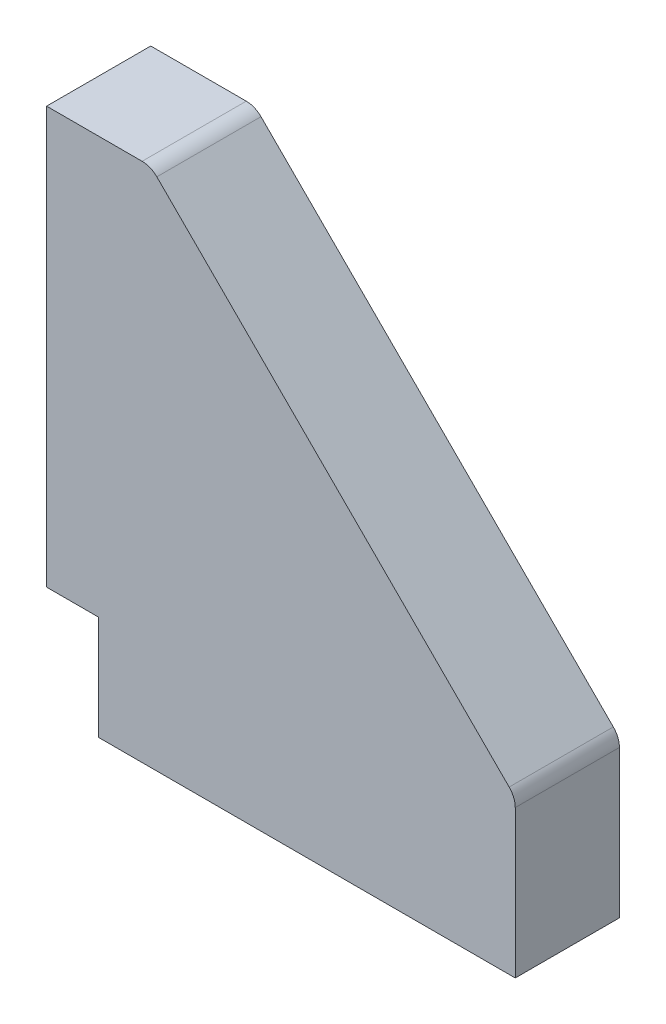
ISO-10303-21;
HEADER;
FILE_DESCRIPTION(('STEP AP214'),'2;1');
FILE_NAME('part.step','',(''),(''),'','','');
FILE_SCHEMA(('AUTOMOTIVE_DESIGN { 1 0 10303 214 1 1 1 1 }'));
ENDSEC;
DATA;
#1=APPLICATION_CONTEXT('core data for automotive mechanical design processes');
#2=APPLICATION_PROTOCOL_DEFINITION('international standard','automotive_design',2000,#1);
#3=PRODUCT_CONTEXT('',#1,'mechanical');
#4=PRODUCT('Part','Part','',(#3));
#5=PRODUCT_RELATED_PRODUCT_CATEGORY('part','',(#4));
#6=PRODUCT_DEFINITION_FORMATION('','',#4);
#7=PRODUCT_DEFINITION_CONTEXT('part definition',#1,'design');
#8=PRODUCT_DEFINITION('design','',#6,#7);
#9=PRODUCT_DEFINITION_SHAPE('','',#8);
#10=(LENGTH_UNIT() NAMED_UNIT(*) SI_UNIT(.MILLI.,.METRE.));
#11=(NAMED_UNIT(*) PLANE_ANGLE_UNIT() SI_UNIT($,.RADIAN.));
#12=(NAMED_UNIT(*) SI_UNIT($,.STERADIAN.) SOLID_ANGLE_UNIT());
#13=UNCERTAINTY_MEASURE_WITH_UNIT(LENGTH_MEASURE(1.E-05),#10,'distance_accuracy_value','');
#14=(GEOMETRIC_REPRESENTATION_CONTEXT(3) GLOBAL_UNCERTAINTY_ASSIGNED_CONTEXT((#13)) GLOBAL_UNIT_ASSIGNED_CONTEXT((#10,
#11,#12)) REPRESENTATION_CONTEXT('',''));
#15=CARTESIAN_POINT('',(0.,0.,0.));
#16=DIRECTION('',(0.,0.,1.));
#17=DIRECTION('',(1.,0.,0.));
#18=AXIS2_PLACEMENT_3D('',#15,#16,#17);
#19=CARTESIAN_POINT('',(0.,0.,12.7));
#20=DIRECTION('',(1.,0.,0.));
#21=DIRECTION('',(0.,0.,-1.));
#22=AXIS2_PLACEMENT_3D('',#19,#20,#21);
#23=PLANE('',#22);
#24=DIRECTION('',(0.,0.,1.));
#25=VECTOR('',#24,1.);
#26=CARTESIAN_POINT('',(0.,0.,0.));
#27=LINE('',#26,#25);
#28=CARTESIAN_POINT('',(0.,0.,0.));
#29=VERTEX_POINT('',#28);
#30=CARTESIAN_POINT('',(0.,0.,12.7));
#31=VERTEX_POINT('',#30);
#32=EDGE_CURVE('E63',#29,#31,#27,.T.);
#33=ORIENTED_EDGE('',*,*,#32,.F.);
#34=DIRECTION('',(0.,-1.,0.));
#35=VECTOR('',#34,1.);
#36=CARTESIAN_POINT('',(0.,0.,0.));
#37=LINE('',#36,#35);
#38=CARTESIAN_POINT('',(0.,-12.7,0.));
#39=VERTEX_POINT('',#38);
#40=EDGE_CURVE('E169',#29,#39,#37,.T.);
#41=ORIENTED_EDGE('',*,*,#40,.T.);
#42=DIRECTION('',(0.,0.,-1.));
#43=VECTOR('',#42,1.);
#44=CARTESIAN_POINT('',(0.,-12.7,0.));
#45=LINE('',#44,#43);
#46=CARTESIAN_POINT('',(0.,-12.7,12.7));
#47=VERTEX_POINT('',#46);
#48=EDGE_CURVE('E173',#47,#39,#45,.T.);
#49=ORIENTED_EDGE('',*,*,#48,.F.);
#50=DIRECTION('',(0.,-1.,0.));
#51=VECTOR('',#50,1.);
#52=CARTESIAN_POINT('',(0.,0.,12.7));
#53=LINE('',#52,#51);
#54=EDGE_CURVE('E230',#31,#47,#53,.T.);
#55=ORIENTED_EDGE('',*,*,#54,.F.);
#56=EDGE_LOOP('',(#33,#41,#49,#55));
#57=FACE_BOUND('',#56,.T.);
#58=ADVANCED_FACE('F48',(#57),#23,.F.);
#59=CARTESIAN_POINT('',(7.62,6.35,6.38525672213319));
#60=DIRECTION('',(-1.,0.,0.));
#61=DIRECTION('',(0.,0.,1.));
#62=AXIS2_PLACEMENT_3D('',#59,#60,#61);
#63=CYLINDRICAL_SURFACE('',#62,3.175);
#64=DIRECTION('',(-1.,0.,0.));
#65=VECTOR('',#64,1.);
#66=CARTESIAN_POINT('',(7.62,7.62,9.29519228843015));
#67=LINE('',#66,#65);
#68=CARTESIAN_POINT('',(5.08,7.62,9.29519228843015));
#69=VERTEX_POINT('',#68);
#70=CARTESIAN_POINT('',(7.62,7.62,9.29519228843015));
#71=VERTEX_POINT('',#70);
#72=EDGE_CURVE('E202',#69,#71,#67,.F.);
#73=ORIENTED_EDGE('',*,*,#72,.F.);
#74=CARTESIAN_POINT('',(6.35,6.35,6.38525672213319));
#75=DIRECTION('',(-0.707106781186548,-0.707106781186547,0.));
#76=DIRECTION('',(-0.707106781186547,0.707106781186548,0.));
#77=AXIS2_PLACEMENT_3D('',#74,#75,#76);
#78=ELLIPSE('',#77,4.49012806053458,3.175);
#79=CARTESIAN_POINT('',(6.35,6.35,9.56025672213319));
#80=VERTEX_POINT('',#79);
#81=EDGE_CURVE('E212',#80,#69,#78,.T.);
#82=ORIENTED_EDGE('',*,*,#81,.F.);
#83=CARTESIAN_POINT('',(6.35,6.35,6.38525672213319));
#84=DIRECTION('',(-0.707106781186547,0.707106781186548,0.));
#85=DIRECTION('',(-0.707106781186548,-0.707106781186547,0.));
#86=AXIS2_PLACEMENT_3D('',#83,#84,#85);
#87=ELLIPSE('',#86,4.49012806053458,3.175);
#88=CARTESIAN_POINT('',(6.35,6.35,3.21025672213319));
#89=VERTEX_POINT('',#88);
#90=EDGE_CURVE('E206',#89,#80,#87,.T.);
#91=ORIENTED_EDGE('',*,*,#90,.F.);
#92=CARTESIAN_POINT('',(5.08000000000001,7.62,3.47532115583623));
#93=VERTEX_POINT('',#92);
#94=EDGE_CURVE('E209',#93,#89,#78,.T.);
#95=ORIENTED_EDGE('',*,*,#94,.F.);
#96=DIRECTION('',(-1.,0.,0.));
#97=VECTOR('',#96,1.);
#98=CARTESIAN_POINT('',(7.62,7.62,3.47532115583623));
#99=LINE('',#98,#97);
#100=CARTESIAN_POINT('',(7.62,7.62,3.47532115583623));
#101=VERTEX_POINT('',#100);
#102=EDGE_CURVE('E196',#101,#93,#99,.T.);
#103=ORIENTED_EDGE('',*,*,#102,.F.);
#104=CARTESIAN_POINT('',(7.62,6.35,6.38525672213319));
#105=DIRECTION('',(-1.,0.,0.));
#106=DIRECTION('',(0.,0.,1.));
#107=AXIS2_PLACEMENT_3D('',#104,#105,#106);
#108=CIRCLE('',#107,3.175);
#109=EDGE_CURVE('E218',#71,#101,#108,.T.);
#110=ORIENTED_EDGE('',*,*,#109,.F.);
#111=EDGE_LOOP('',(#73,#82,#91,#95,#103,#110));
#112=FACE_BOUND('',#111,.T.);
#113=CARTESIAN_POINT('',(-6.35,6.35,6.38525672213319));
#114=DIRECTION('',(-1.,0.,0.));
#115=DIRECTION('',(0.,0.,1.));
#116=AXIS2_PLACEMENT_3D('',#113,#114,#115);
#117=CIRCLE('',#116,3.175);
#118=CARTESIAN_POINT('',(-6.35,6.35,9.56025672213319));
#119=VERTEX_POINT('',#118);
#120=EDGE_CURVE('E357',#119,#119,#117,.T.);
#121=ORIENTED_EDGE('',*,*,#120,.T.);
#122=EDGE_LOOP('',(#121));
#123=FACE_BOUND('',#122,.T.);
#124=ADVANCED_FACE('F288',(#112,#123),#63,.F.);
#125=CARTESIAN_POINT('',(7.62,6.35,6.38525672213319));
#126=DIRECTION('',(-1.,0.,0.));
#127=DIRECTION('',(0.,0.,1.));
#128=AXIS2_PLACEMENT_3D('',#125,#126,#127);
#129=PLANE('',#128);
#130=ORIENTED_EDGE('',*,*,#109,.T.);
#131=DIRECTION('',(0.,0.,1.));
#132=VECTOR('',#131,1.);
#133=CARTESIAN_POINT('',(7.62,7.62,6.38525672213319));
#134=LINE('',#133,#132);
#135=EDGE_CURVE('E258',#101,#71,#134,.T.);
#136=ORIENTED_EDGE('',*,*,#135,.T.);
#137=EDGE_LOOP('',(#130,#136));
#138=FACE_BOUND('',#137,.T.);
#139=ADVANCED_FACE('F293',(#138),#129,.T.);
#140=CARTESIAN_POINT('',(50.8,6.35,12.7));
#141=DIRECTION('',(-1.,0.,0.));
#142=DIRECTION('',(0.,0.,1.));
#143=AXIS2_PLACEMENT_3D('',#140,#141,#142);
#144=PLANE('',#143);
#145=DIRECTION('',(0.,1.,0.));
#146=VECTOR('',#145,1.);
#147=CARTESIAN_POINT('',(50.8,6.35,0.));
#148=LINE('',#147,#146);
#149=CARTESIAN_POINT('',(50.8,-12.7,0.));
#150=VERTEX_POINT('',#149);
#151=CARTESIAN_POINT('',(50.8,5.29789755157234,0.));
#152=VERTEX_POINT('',#151);
#153=EDGE_CURVE('E217',#150,#152,#148,.T.);
#154=ORIENTED_EDGE('',*,*,#153,.T.);
#155=DIRECTION('',(0.,0.,-1.));
#156=VECTOR('',#155,1.);
#157=CARTESIAN_POINT('',(50.8,5.29789755157234,12.7));
#158=LINE('',#157,#156);
#159=CARTESIAN_POINT('',(50.8,5.29789755157234,12.7));
#160=VERTEX_POINT('',#159);
#161=EDGE_CURVE('E249',#152,#160,#158,.F.);
#162=ORIENTED_EDGE('',*,*,#161,.T.);
#163=DIRECTION('',(0.,1.,0.));
#164=VECTOR('',#163,1.);
#165=CARTESIAN_POINT('',(50.8,6.35,12.7));
#166=LINE('',#165,#164);
#167=CARTESIAN_POINT('',(50.8,-12.7,12.7));
#168=VERTEX_POINT('',#167);
#169=EDGE_CURVE('E222',#168,#160,#166,.T.);
#170=ORIENTED_EDGE('',*,*,#169,.F.);
#171=DIRECTION('',(0.,0.,1.));
#172=VECTOR('',#171,1.);
#173=CARTESIAN_POINT('',(50.8,-12.7,0.));
#174=LINE('',#173,#172);
#175=EDGE_CURVE('E183',#150,#168,#174,.T.);
#176=ORIENTED_EDGE('',*,*,#175,.F.);
#177=EDGE_LOOP('',(#154,#162,#170,#176));
#178=FACE_BOUND('',#177,.T.);
#179=ADVANCED_FACE('F315',(#178),#144,.F.);
#180=CARTESIAN_POINT('',(6.35,50.8,12.7));
#181=DIRECTION('',(-0.707106781186548,-0.707106781186548,0.));
#182=DIRECTION('',(0.707106781186548,-0.707106781186548,0.));
#183=AXIS2_PLACEMENT_3D('',#180,#181,#182);
#184=PLANE('',#183);
#185=DIRECTION('',(-0.707106781186547,0.707106781186547,0.));
#186=VECTOR('',#185,1.);
#187=CARTESIAN_POINT('',(6.35,50.8,12.7));
#188=LINE('',#187,#186);
#189=CARTESIAN_POINT('',(50.0560512242138,7.09394877578618,12.7));
#190=VERTEX_POINT('',#189);
#191=CARTESIAN_POINT('',(7.09394877578617,50.0560512242138,12.7));
#192=VERTEX_POINT('',#191);
#193=EDGE_CURVE('E225',#190,#192,#188,.T.);
#194=ORIENTED_EDGE('',*,*,#193,.F.);
#195=DIRECTION('',(0.,0.,-1.));
#196=VECTOR('',#195,1.);
#197=CARTESIAN_POINT('',(50.0560512242138,7.09394877578618,12.7));
#198=LINE('',#197,#196);
#199=CARTESIAN_POINT('',(50.0560512242138,7.09394877578618,0.));
#200=VERTEX_POINT('',#199);
#201=EDGE_CURVE('E242',#190,#200,#198,.T.);
#202=ORIENTED_EDGE('',*,*,#201,.T.);
#203=DIRECTION('',(-0.707106781186547,0.707106781186547,0.));
#204=VECTOR('',#203,1.);
#205=CARTESIAN_POINT('',(6.35,50.8,0.));
#206=LINE('',#205,#204);
#207=CARTESIAN_POINT('',(7.09394877578617,50.0560512242138,0.));
#208=VERTEX_POINT('',#207);
#209=EDGE_CURVE('E235',#200,#208,#206,.T.);
#210=ORIENTED_EDGE('',*,*,#209,.T.);
#211=DIRECTION('',(0.,0.,-1.));
#212=VECTOR('',#211,1.);
#213=CARTESIAN_POINT('',(7.09394877578617,50.0560512242138,12.7));
#214=LINE('',#213,#212);
#215=EDGE_CURVE('E232',#208,#192,#214,.F.);
#216=ORIENTED_EDGE('',*,*,#215,.T.);
#217=EDGE_LOOP('',(#194,#202,#210,#216));
#218=FACE_BOUND('',#217,.T.);
#219=ADVANCED_FACE('F328',(#218),#184,.F.);
#220=CARTESIAN_POINT('',(0.,50.8,12.7));
#221=DIRECTION('',(0.,-1.,0.));
#222=DIRECTION('',(0.,0.,-1.));
#223=AXIS2_PLACEMENT_3D('',#220,#221,#222);
#224=PLANE('',#223);
#225=DIRECTION('',(-1.,0.,0.));
#226=VECTOR('',#225,1.);
#227=CARTESIAN_POINT('',(0.,50.8,12.7));
#228=LINE('',#227,#226);
#229=CARTESIAN_POINT('',(5.29789755157234,50.8,12.7));
#230=VERTEX_POINT('',#229);
#231=CARTESIAN_POINT('',(-6.35,50.8,12.7));
#232=VERTEX_POINT('',#231);
#233=EDGE_CURVE('E228',#230,#232,#228,.T.);
#234=ORIENTED_EDGE('',*,*,#233,.F.);
#235=DIRECTION('',(0.,0.,-1.));
#236=VECTOR('',#235,1.);
#237=CARTESIAN_POINT('',(5.29789755157234,50.8,12.7));
#238=LINE('',#237,#236);
#239=CARTESIAN_POINT('',(5.29789755157234,50.8,0.));
#240=VERTEX_POINT('',#239);
#241=EDGE_CURVE('E255',#230,#240,#238,.T.);
#242=ORIENTED_EDGE('',*,*,#241,.T.);
#243=DIRECTION('',(-1.,0.,0.));
#244=VECTOR('',#243,1.);
#245=CARTESIAN_POINT('',(0.,50.8,0.));
#246=LINE('',#245,#244);
#247=CARTESIAN_POINT('',(-6.35,50.8,0.));
#248=VERTEX_POINT('',#247);
#249=EDGE_CURVE('E238',#240,#248,#246,.T.);
#250=ORIENTED_EDGE('',*,*,#249,.T.);
#251=DIRECTION('',(0.,0.,-1.));
#252=VECTOR('',#251,1.);
#253=CARTESIAN_POINT('',(-6.35,50.8,0.));
#254=LINE('',#253,#252);
#255=EDGE_CURVE('E162',#232,#248,#254,.T.);
#256=ORIENTED_EDGE('',*,*,#255,.F.);
#257=EDGE_LOOP('',(#234,#242,#250,#256));
#258=FACE_BOUND('',#257,.T.);
#259=ADVANCED_FACE('F324',(#258),#224,.F.);
#260=CARTESIAN_POINT('',(0.,0.,12.7));
#261=DIRECTION('',(0.,0.,-1.));
#262=DIRECTION('',(-1.,0.,0.));
#263=AXIS2_PLACEMENT_3D('',#260,#261,#262);
#264=PLANE('',#263);
#265=ORIENTED_EDGE('',*,*,#169,.T.);
#266=CARTESIAN_POINT('',(48.26,5.29789755157234,12.7));
#267=DIRECTION('',(0.,0.,-1.));
#268=DIRECTION('',(-1.,0.,0.));
#269=AXIS2_PLACEMENT_3D('',#266,#267,#268);
#270=CIRCLE('',#269,2.54);
#271=EDGE_CURVE('E253',#160,#190,#270,.F.);
#272=ORIENTED_EDGE('',*,*,#271,.T.);
#273=ORIENTED_EDGE('',*,*,#193,.T.);
#274=CARTESIAN_POINT('',(5.29789755157234,48.26,12.7));
#275=DIRECTION('',(0.,0.,-1.));
#276=DIRECTION('',(-1.,0.,0.));
#277=AXIS2_PLACEMENT_3D('',#274,#275,#276);
#278=CIRCLE('',#277,2.54);
#279=EDGE_CURVE('E251',#192,#230,#278,.F.);
#280=ORIENTED_EDGE('',*,*,#279,.T.);
#281=ORIENTED_EDGE('',*,*,#233,.T.);
#282=DIRECTION('',(0.,1.,0.));
#283=VECTOR('',#282,1.);
#284=CARTESIAN_POINT('',(-6.35,50.8,12.7));
#285=LINE('',#284,#283);
#286=CARTESIAN_POINT('',(-6.35,0.,12.7));
#287=VERTEX_POINT('',#286);
#288=EDGE_CURVE('E154',#287,#232,#285,.T.);
#289=ORIENTED_EDGE('',*,*,#288,.F.);
#290=DIRECTION('',(1.,0.,0.));
#291=VECTOR('',#290,1.);
#292=CARTESIAN_POINT('',(-6.35,0.,12.7));
#293=LINE('',#292,#291);
#294=EDGE_CURVE('E150',#287,#31,#293,.T.);
#295=ORIENTED_EDGE('',*,*,#294,.T.);
#296=ORIENTED_EDGE('',*,*,#54,.T.);
#297=DIRECTION('',(-1.,0.,0.));
#298=VECTOR('',#297,1.);
#299=CARTESIAN_POINT('',(0.,-12.7,12.7));
#300=LINE('',#299,#298);
#301=EDGE_CURVE('E186',#168,#47,#300,.T.);
#302=ORIENTED_EDGE('',*,*,#301,.F.);
#303=EDGE_LOOP('',(#265,#272,#273,#280,#281,#289,#295,#296,#302));
#304=FACE_BOUND('',#303,.T.);
#305=ADVANCED_FACE('F327',(#304),#264,.F.);
#306=CARTESIAN_POINT('',(0.,0.,0.));
#307=DIRECTION('',(0.,0.,-1.));
#308=DIRECTION('',(-1.,0.,0.));
#309=AXIS2_PLACEMENT_3D('',#306,#307,#308);
#310=PLANE('',#309);
#311=ORIENTED_EDGE('',*,*,#209,.F.);
#312=CARTESIAN_POINT('',(48.26,5.29789755157234,0.));
#313=DIRECTION('',(0.,0.,-1.));
#314=DIRECTION('',(-1.,0.,0.));
#315=AXIS2_PLACEMENT_3D('',#312,#313,#314);
#316=CIRCLE('',#315,2.54);
#317=EDGE_CURVE('E247',#200,#152,#316,.T.);
#318=ORIENTED_EDGE('',*,*,#317,.T.);
#319=ORIENTED_EDGE('',*,*,#153,.F.);
#320=DIRECTION('',(1.,0.,0.));
#321=VECTOR('',#320,1.);
#322=CARTESIAN_POINT('',(0.,-12.7,0.));
#323=LINE('',#322,#321);
#324=EDGE_CURVE('E180',#39,#150,#323,.T.);
#325=ORIENTED_EDGE('',*,*,#324,.F.);
#326=ORIENTED_EDGE('',*,*,#40,.F.);
#327=DIRECTION('',(1.,0.,0.));
#328=VECTOR('',#327,1.);
#329=CARTESIAN_POINT('',(-6.35,0.,0.));
#330=LINE('',#329,#328);
#331=CARTESIAN_POINT('',(-6.35,0.,0.));
#332=VERTEX_POINT('',#331);
#333=EDGE_CURVE('E148',#332,#29,#330,.T.);
#334=ORIENTED_EDGE('',*,*,#333,.F.);
#335=DIRECTION('',(0.,-1.,0.));
#336=VECTOR('',#335,1.);
#337=CARTESIAN_POINT('',(-6.35,50.8,0.));
#338=LINE('',#337,#336);
#339=EDGE_CURVE('E155',#248,#332,#338,.T.);
#340=ORIENTED_EDGE('',*,*,#339,.F.);
#341=ORIENTED_EDGE('',*,*,#249,.F.);
#342=CARTESIAN_POINT('',(5.29789755157234,48.26,0.));
#343=DIRECTION('',(0.,0.,-1.));
#344=DIRECTION('',(-1.,0.,0.));
#345=AXIS2_PLACEMENT_3D('',#342,#343,#344);
#346=CIRCLE('',#345,2.54);
#347=EDGE_CURVE('E245',#240,#208,#346,.T.);
#348=ORIENTED_EDGE('',*,*,#347,.T.);
#349=EDGE_LOOP('',(#311,#318,#319,#325,#326,#334,#340,#341,#348));
#350=FACE_BOUND('',#349,.T.);
#351=ADVANCED_FACE('F167',(#350),#310,.T.);
#352=CARTESIAN_POINT('',(48.26,5.29789755157234,12.7));
#353=DIRECTION('',(0.,0.,-1.));
#354=DIRECTION('',(-1.,0.,0.));
#355=AXIS2_PLACEMENT_3D('',#352,#353,#354);
#356=CYLINDRICAL_SURFACE('',#355,2.54);
#357=ORIENTED_EDGE('',*,*,#271,.F.);
#358=ORIENTED_EDGE('',*,*,#161,.F.);
#359=ORIENTED_EDGE('',*,*,#317,.F.);
#360=ORIENTED_EDGE('',*,*,#201,.F.);
#361=EDGE_LOOP('',(#357,#358,#359,#360));
#362=FACE_BOUND('',#361,.T.);
#363=ADVANCED_FACE('F335',(#362),#356,.T.);
#364=CARTESIAN_POINT('',(5.29789755157234,48.26,12.7));
#365=DIRECTION('',(0.,0.,-1.));
#366=DIRECTION('',(-1.,0.,0.));
#367=AXIS2_PLACEMENT_3D('',#364,#365,#366);
#368=CYLINDRICAL_SURFACE('',#367,2.54);
#369=ORIENTED_EDGE('',*,*,#279,.F.);
#370=ORIENTED_EDGE('',*,*,#215,.F.);
#371=ORIENTED_EDGE('',*,*,#347,.F.);
#372=ORIENTED_EDGE('',*,*,#241,.F.);
#373=EDGE_LOOP('',(#369,#370,#371,#372));
#374=FACE_BOUND('',#373,.T.);
#375=ADVANCED_FACE('F50',(#374),#368,.T.);
#376=CARTESIAN_POINT('',(6.35,7.62,6.38525672213319));
#377=DIRECTION('',(0.,-1.,0.));
#378=DIRECTION('',(0.,0.,1.));
#379=AXIS2_PLACEMENT_3D('',#376,#377,#378);
#380=PLANE('',#379);
#381=CARTESIAN_POINT('',(6.35,7.62,6.38525672213319));
#382=DIRECTION('',(0.,1.,0.));
#383=DIRECTION('',(0.,0.,1.));
#384=AXIS2_PLACEMENT_3D('',#381,#382,#383);
#385=CIRCLE('',#384,3.175);
#386=EDGE_CURVE('E197',#71,#101,#385,.T.);
#387=ORIENTED_EDGE('',*,*,#386,.F.);
#388=ORIENTED_EDGE('',*,*,#135,.F.);
#389=EDGE_LOOP('',(#387,#388));
#390=FACE_BOUND('',#389,.T.);
#391=ADVANCED_FACE('F296',(#390),#380,.T.);
#392=CARTESIAN_POINT('',(6.35,7.62,6.38525672213319));
#393=DIRECTION('',(0.,-1.,0.));
#394=DIRECTION('',(1.,0.,0.));
#395=AXIS2_PLACEMENT_3D('',#392,#393,#394);
#396=CYLINDRICAL_SURFACE('',#395,3.175);
#397=CARTESIAN_POINT('',(6.35,6.35,6.38525672213319));
#398=DIRECTION('',(-0.707106781186548,-0.707106781186547,0.));
#399=DIRECTION('',(-0.707106781186547,0.707106781186548,0.));
#400=AXIS2_PLACEMENT_3D('',#397,#398,#399);
#401=ELLIPSE('',#400,4.49012806053458,3.175);
#402=CARTESIAN_POINT('',(7.62,5.08,3.47532115583623));
#403=VERTEX_POINT('',#402);
#404=EDGE_CURVE('E71',#403,#89,#401,.F.);
#405=ORIENTED_EDGE('',*,*,#404,.T.);
#406=ORIENTED_EDGE('',*,*,#90,.T.);
#407=CARTESIAN_POINT('',(7.62,5.08,9.29519228843015));
#408=VERTEX_POINT('',#407);
#409=EDGE_CURVE('E211',#80,#408,#401,.F.);
#410=ORIENTED_EDGE('',*,*,#409,.T.);
#411=DIRECTION('',(0.,-1.,0.));
#412=VECTOR('',#411,1.);
#413=CARTESIAN_POINT('',(7.62,7.62,9.29519228843015));
#414=LINE('',#413,#412);
#415=EDGE_CURVE('E56',#71,#408,#414,.T.);
#416=ORIENTED_EDGE('',*,*,#415,.F.);
#417=ORIENTED_EDGE('',*,*,#386,.T.);
#418=DIRECTION('',(0.,-1.,0.));
#419=VECTOR('',#418,1.);
#420=CARTESIAN_POINT('',(7.62,7.62,3.47532115583623));
#421=LINE('',#420,#419);
#422=EDGE_CURVE('E13',#403,#101,#421,.F.);
#423=ORIENTED_EDGE('',*,*,#422,.F.);
#424=EDGE_LOOP('',(#405,#406,#410,#416,#417,#423));
#425=FACE_BOUND('',#424,.T.);
#426=CARTESIAN_POINT('',(6.35,-12.7,6.38525672213319));
#427=DIRECTION('',(0.,-1.,0.));
#428=DIRECTION('',(1.,0.,0.));
#429=AXIS2_PLACEMENT_3D('',#426,#427,#428);
#430=CIRCLE('',#429,3.175);
#431=CARTESIAN_POINT('',(9.525,-12.7,6.38525672213319));
#432=VERTEX_POINT('',#431);
#433=EDGE_CURVE('E170',#432,#432,#430,.F.);
#434=ORIENTED_EDGE('',*,*,#433,.F.);
#435=EDGE_LOOP('',(#434));
#436=FACE_BOUND('',#435,.T.);
#437=ADVANCED_FACE('F297',(#425,#436),#396,.F.);
#438=EDGE_CURVE('E221',#408,#71,#108,.T.);
#439=ORIENTED_EDGE('',*,*,#438,.T.);
#440=ORIENTED_EDGE('',*,*,#415,.T.);
#441=EDGE_LOOP('',(#439,#440));
#442=FACE_BOUND('',#441,.T.);
#443=ADVANCED_FACE('F265',(#442),#129,.T.);
#444=ORIENTED_EDGE('',*,*,#409,.F.);
#445=CARTESIAN_POINT('',(6.35,6.35,6.38525672213319));
#446=DIRECTION('',(-0.707106781186547,0.707106781186548,0.));
#447=DIRECTION('',(-0.707106781186548,-0.707106781186547,0.));
#448=AXIS2_PLACEMENT_3D('',#445,#446,#447);
#449=ELLIPSE('',#448,4.49012806053458,3.175);
#450=EDGE_CURVE('E204',#71,#80,#449,.F.);
#451=ORIENTED_EDGE('',*,*,#450,.F.);
#452=ORIENTED_EDGE('',*,*,#438,.F.);
#453=EDGE_LOOP('',(#444,#451,#452));
#454=FACE_BOUND('',#453,.T.);
#455=ADVANCED_FACE('F269',(#454),#63,.F.);
#456=EDGE_CURVE('E220',#101,#403,#108,.T.);
#457=ORIENTED_EDGE('',*,*,#456,.T.);
#458=ORIENTED_EDGE('',*,*,#422,.T.);
#459=EDGE_LOOP('',(#457,#458));
#460=FACE_BOUND('',#459,.T.);
#461=ADVANCED_FACE('F303',(#460),#129,.T.);
#462=ORIENTED_EDGE('',*,*,#404,.F.);
#463=ORIENTED_EDGE('',*,*,#456,.F.);
#464=EDGE_CURVE('E207',#89,#101,#449,.F.);
#465=ORIENTED_EDGE('',*,*,#464,.F.);
#466=EDGE_LOOP('',(#462,#463,#465));
#467=FACE_BOUND('',#466,.T.);
#468=ADVANCED_FACE('F302',(#467),#63,.F.);
#469=ORIENTED_EDGE('',*,*,#102,.T.);
#470=EDGE_CURVE('E200',#101,#93,#385,.T.);
#471=ORIENTED_EDGE('',*,*,#470,.F.);
#472=EDGE_LOOP('',(#469,#471));
#473=FACE_BOUND('',#472,.T.);
#474=ADVANCED_FACE('F310',(#473),#380,.T.);
#475=ORIENTED_EDGE('',*,*,#464,.T.);
#476=ORIENTED_EDGE('',*,*,#470,.T.);
#477=ORIENTED_EDGE('',*,*,#94,.T.);
#478=EDGE_LOOP('',(#475,#476,#477));
#479=FACE_BOUND('',#478,.T.);
#480=ADVANCED_FACE('F389',(#479),#396,.F.);
#481=ORIENTED_EDGE('',*,*,#81,.T.);
#482=EDGE_CURVE('E192',#69,#71,#385,.T.);
#483=ORIENTED_EDGE('',*,*,#482,.T.);
#484=ORIENTED_EDGE('',*,*,#450,.T.);
#485=EDGE_LOOP('',(#481,#483,#484));
#486=FACE_BOUND('',#485,.T.);
#487=ADVANCED_FACE('F280',(#486),#396,.F.);
#488=ORIENTED_EDGE('',*,*,#72,.T.);
#489=ORIENTED_EDGE('',*,*,#482,.F.);
#490=EDGE_LOOP('',(#488,#489));
#491=FACE_BOUND('',#490,.T.);
#492=ADVANCED_FACE('F286',(#491),#380,.T.);
#493=CARTESIAN_POINT('',(0.,-12.7,0.));
#494=DIRECTION('',(0.,-1.,0.));
#495=DIRECTION('',(1.,0.,0.));
#496=AXIS2_PLACEMENT_3D('',#493,#494,#495);
#497=PLANE('',#496);
#498=ORIENTED_EDGE('',*,*,#433,.T.);
#499=EDGE_LOOP('',(#498));
#500=FACE_BOUND('',#499,.T.);
#501=ORIENTED_EDGE('',*,*,#48,.T.);
#502=ORIENTED_EDGE('',*,*,#324,.T.);
#503=ORIENTED_EDGE('',*,*,#175,.T.);
#504=ORIENTED_EDGE('',*,*,#301,.T.);
#505=EDGE_LOOP('',(#501,#502,#503,#504));
#506=FACE_BOUND('',#505,.T.);
#507=CARTESIAN_POINT('',(44.45,-12.7,6.38525672213319));
#508=DIRECTION('',(0.,-1.,0.));
#509=DIRECTION('',(1.,0.,0.));
#510=AXIS2_PLACEMENT_3D('',#507,#508,#509);
#511=CIRCLE('',#510,3.175);
#512=CARTESIAN_POINT('',(47.625,-12.7,6.38525672213319));
#513=VERTEX_POINT('',#512);
#514=EDGE_CURVE('E189',#513,#513,#511,.F.);
#515=ORIENTED_EDGE('',*,*,#514,.T.);
#516=EDGE_LOOP('',(#515));
#517=FACE_BOUND('',#516,.T.);
#518=ADVANCED_FACE('F378',(#500,#506,#517),#497,.T.);
#519=CARTESIAN_POINT('',(44.45,7.61999999999998,6.38525672213319));
#520=DIRECTION('',(0.,-1.,0.));
#521=DIRECTION('',(0.,0.,1.));
#522=AXIS2_PLACEMENT_3D('',#519,#520,#521);
#523=PLANE('',#522);
#524=CARTESIAN_POINT('',(44.45,7.61999999999998,6.38525672213319));
#525=DIRECTION('',(0.,1.,0.));
#526=DIRECTION('',(0.,0.,1.));
#527=AXIS2_PLACEMENT_3D('',#524,#525,#526);
#528=CIRCLE('',#527,3.175);
#529=CARTESIAN_POINT('',(44.45,7.61999999999998,9.56025672213319));
#530=VERTEX_POINT('',#529);
#531=EDGE_CURVE('E193',#530,#530,#528,.T.);
#532=ORIENTED_EDGE('',*,*,#531,.F.);
#533=EDGE_LOOP('',(#532));
#534=FACE_BOUND('',#533,.T.);
#535=ADVANCED_FACE('F374',(#534),#523,.T.);
#536=CARTESIAN_POINT('',(44.45,7.61999999999998,6.38525672213319));
#537=DIRECTION('',(0.,-1.,0.));
#538=DIRECTION('',(1.,0.,0.));
#539=AXIS2_PLACEMENT_3D('',#536,#537,#538);
#540=CYLINDRICAL_SURFACE('',#539,3.175);
#541=ORIENTED_EDGE('',*,*,#531,.T.);
#542=EDGE_LOOP('',(#541));
#543=FACE_BOUND('',#542,.T.);
#544=ORIENTED_EDGE('',*,*,#514,.F.);
#545=EDGE_LOOP('',(#544));
#546=FACE_BOUND('',#545,.T.);
#547=ADVANCED_FACE('F365',(#543,#546),#540,.F.);
#548=CARTESIAN_POINT('',(-6.35,0.,0.));
#549=DIRECTION('',(-1.,0.,0.));
#550=DIRECTION('',(0.,0.,1.));
#551=AXIS2_PLACEMENT_3D('',#548,#549,#550);
#552=PLANE('',#551);
#553=CARTESIAN_POINT('',(-6.35,44.45,6.38525672213319));
#554=DIRECTION('',(-1.,0.,0.));
#555=DIRECTION('',(0.,0.,1.));
#556=AXIS2_PLACEMENT_3D('',#553,#554,#555);
#557=CIRCLE('',#556,3.175);
#558=CARTESIAN_POINT('',(-6.35,44.45,9.5602567221332));
#559=VERTEX_POINT('',#558);
#560=EDGE_CURVE('E355',#559,#559,#557,.T.);
#561=ORIENTED_EDGE('',*,*,#560,.F.);
#562=EDGE_LOOP('',(#561));
#563=FACE_BOUND('',#562,.T.);
#564=ORIENTED_EDGE('',*,*,#339,.T.);
#565=DIRECTION('',(0.,0.,1.));
#566=VECTOR('',#565,1.);
#567=CARTESIAN_POINT('',(-6.35,0.,0.));
#568=LINE('',#567,#566);
#569=EDGE_CURVE('E144',#332,#287,#568,.T.);
#570=ORIENTED_EDGE('',*,*,#569,.T.);
#571=ORIENTED_EDGE('',*,*,#288,.T.);
#572=ORIENTED_EDGE('',*,*,#255,.T.);
#573=EDGE_LOOP('',(#564,#570,#571,#572));
#574=FACE_BOUND('',#573,.T.);
#575=ORIENTED_EDGE('',*,*,#120,.F.);
#576=EDGE_LOOP('',(#575));
#577=FACE_BOUND('',#576,.T.);
#578=ADVANCED_FACE('F159',(#563,#574,#577),#552,.T.);
#579=CARTESIAN_POINT('',(-6.35,0.,0.));
#580=DIRECTION('',(0.,1.,0.));
#581=DIRECTION('',(0.,0.,1.));
#582=AXIS2_PLACEMENT_3D('',#579,#580,#581);
#583=PLANE('',#582);
#584=ORIENTED_EDGE('',*,*,#32,.T.);
#585=ORIENTED_EDGE('',*,*,#294,.F.);
#586=ORIENTED_EDGE('',*,*,#569,.F.);
#587=ORIENTED_EDGE('',*,*,#333,.T.);
#588=EDGE_LOOP('',(#584,#585,#586,#587));
#589=FACE_BOUND('',#588,.T.);
#590=ADVANCED_FACE('F146',(#589),#583,.F.);
#591=CARTESIAN_POINT('',(7.62,44.45,6.38525672213319));
#592=DIRECTION('',(-1.,0.,0.));
#593=DIRECTION('',(0.,0.,1.));
#594=AXIS2_PLACEMENT_3D('',#591,#592,#593);
#595=PLANE('',#594);
#596=CARTESIAN_POINT('',(7.62,44.45,6.38525672213319));
#597=DIRECTION('',(-1.,0.,0.));
#598=DIRECTION('',(0.,0.,1.));
#599=AXIS2_PLACEMENT_3D('',#596,#597,#598);
#600=CIRCLE('',#599,3.175);
#601=CARTESIAN_POINT('',(7.62,44.45,9.56025672213319));
#602=VERTEX_POINT('',#601);
#603=EDGE_CURVE('E214',#602,#602,#600,.T.);
#604=ORIENTED_EDGE('',*,*,#603,.T.);
#605=EDGE_LOOP('',(#604));
#606=FACE_BOUND('',#605,.T.);
#607=ADVANCED_FACE('F372',(#606),#595,.T.);
#608=CARTESIAN_POINT('',(7.62,44.45,6.38525672213319));
#609=DIRECTION('',(-1.,0.,0.));
#610=DIRECTION('',(0.,0.,1.));
#611=AXIS2_PLACEMENT_3D('',#608,#609,#610);
#612=CYLINDRICAL_SURFACE('',#611,3.175);
#613=ORIENTED_EDGE('',*,*,#603,.F.);
#614=EDGE_LOOP('',(#613));
#615=FACE_BOUND('',#614,.T.);
#616=ORIENTED_EDGE('',*,*,#560,.T.);
#617=EDGE_LOOP('',(#616));
#618=FACE_BOUND('',#617,.T.);
#619=ADVANCED_FACE('F391',(#615,#618),#612,.F.);
#620=CLOSED_SHELL('',(#58,#124,#139,#179,#219,#259,#305,#351,#363,#375,#391,#437,#443,#455,#461,
#468,#474,#480,#487,#492,#518,#535,#547,#578,#590,#607,#619));
#621=MANIFOLD_SOLID_BREP('B2',#620);
#622=ADVANCED_BREP_SHAPE_REPRESENTATION('',(#18,#621),#14);
#623=SHAPE_DEFINITION_REPRESENTATION(#9,#622);
ENDSEC;
END-ISO-10303-21;
